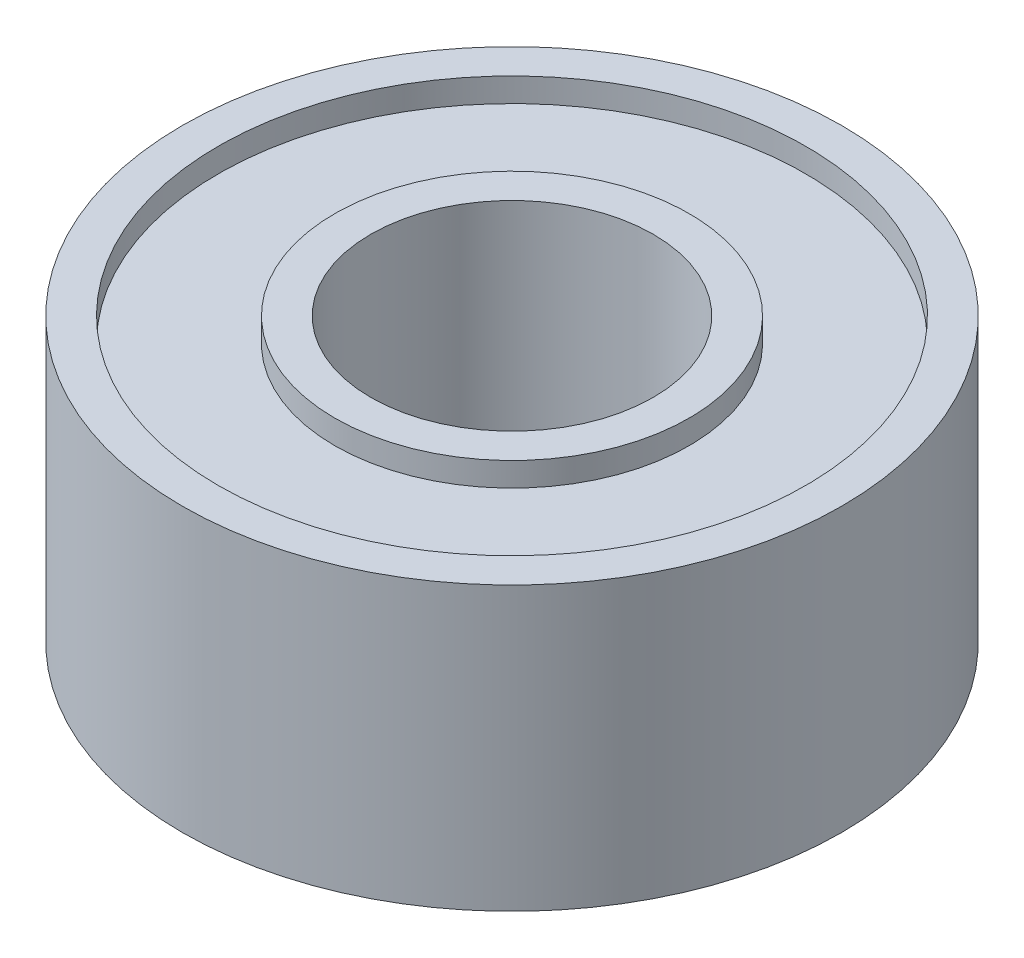
ISO-10303-21;
HEADER;
FILE_DESCRIPTION(('STEP AP214'),'2;1');
FILE_NAME('part.step','',(''),(''),'','','');
FILE_SCHEMA(('AUTOMOTIVE_DESIGN { 1 0 10303 214 1 1 1 1 }'));
ENDSEC;
DATA;
#1=APPLICATION_CONTEXT('core data for automotive mechanical design processes');
#2=APPLICATION_PROTOCOL_DEFINITION('international standard','automotive_design',2000,#1);
#3=PRODUCT_CONTEXT('',#1,'mechanical');
#4=PRODUCT('Part','Part','',(#3));
#5=PRODUCT_RELATED_PRODUCT_CATEGORY('part','',(#4));
#6=PRODUCT_DEFINITION_FORMATION('','',#4);
#7=PRODUCT_DEFINITION_CONTEXT('part definition',#1,'design');
#8=PRODUCT_DEFINITION('design','',#6,#7);
#9=PRODUCT_DEFINITION_SHAPE('','',#8);
#10=(LENGTH_UNIT() NAMED_UNIT(*) SI_UNIT(.MILLI.,.METRE.));
#11=(NAMED_UNIT(*) PLANE_ANGLE_UNIT() SI_UNIT($,.RADIAN.));
#12=(NAMED_UNIT(*) SI_UNIT($,.STERADIAN.) SOLID_ANGLE_UNIT());
#13=UNCERTAINTY_MEASURE_WITH_UNIT(LENGTH_MEASURE(1.E-05),#10,'distance_accuracy_value','');
#14=(GEOMETRIC_REPRESENTATION_CONTEXT(3) GLOBAL_UNCERTAINTY_ASSIGNED_CONTEXT((#13)) GLOBAL_UNIT_ASSIGNED_CONTEXT((#10,
#11,#12)) REPRESENTATION_CONTEXT('',''));
#15=CARTESIAN_POINT('',(0.,0.,0.));
#16=DIRECTION('',(0.,0.,1.));
#17=DIRECTION('',(1.,0.,0.));
#18=AXIS2_PLACEMENT_3D('',#15,#16,#17);
#19=CARTESIAN_POINT('',(0.,-1.5,0.));
#20=DIRECTION('',(0.,1.,0.));
#21=DIRECTION('',(0.,0.,1.));
#22=AXIS2_PLACEMENT_3D('',#19,#20,#21);
#23=PLANE('',#22);
#24=CARTESIAN_POINT('',(0.,-1.5,0.));
#25=DIRECTION('',(0.,1.,0.));
#26=DIRECTION('',(0.,0.,1.));
#27=AXIS2_PLACEMENT_3D('',#24,#25,#26);
#28=CIRCLE('',#27,1.5);
#29=CARTESIAN_POINT('',(0.,-1.5,1.5));
#30=VERTEX_POINT('',#29);
#31=EDGE_CURVE('E58',#30,#30,#28,.T.);
#32=ORIENTED_EDGE('',*,*,#31,.T.);
#33=EDGE_LOOP('',(#32));
#34=FACE_BOUND('',#33,.T.);
#35=CARTESIAN_POINT('',(0.,-1.5,0.));
#36=DIRECTION('',(0.,1.,0.));
#37=DIRECTION('',(0.,0.,1.));
#38=AXIS2_PLACEMENT_3D('',#35,#36,#37);
#39=CIRCLE('',#38,1.881);
#40=CARTESIAN_POINT('',(0.,-1.5,1.881));
#41=VERTEX_POINT('',#40);
#42=EDGE_CURVE('E90',#41,#41,#39,.T.);
#43=ORIENTED_EDGE('',*,*,#42,.F.);
#44=EDGE_LOOP('',(#43));
#45=FACE_BOUND('',#44,.T.);
#46=ADVANCED_FACE('F43',(#34,#45),#23,.F.);
#47=CARTESIAN_POINT('',(0.,1.5,0.));
#48=DIRECTION('',(0.,1.,0.));
#49=DIRECTION('',(0.,0.,1.));
#50=AXIS2_PLACEMENT_3D('',#47,#48,#49);
#51=PLANE('',#50);
#52=CARTESIAN_POINT('',(0.,1.5,0.));
#53=DIRECTION('',(0.,1.,0.));
#54=DIRECTION('',(0.,0.,1.));
#55=AXIS2_PLACEMENT_3D('',#52,#53,#54);
#56=CIRCLE('',#55,1.5);
#57=CARTESIAN_POINT('',(0.,1.5,1.5));
#58=VERTEX_POINT('',#57);
#59=EDGE_CURVE('E56',#58,#58,#56,.T.);
#60=ORIENTED_EDGE('',*,*,#59,.F.);
#61=EDGE_LOOP('',(#60));
#62=FACE_BOUND('',#61,.T.);
#63=CARTESIAN_POINT('',(0.,1.5,0.));
#64=DIRECTION('',(0.,1.,0.));
#65=DIRECTION('',(0.,0.,1.));
#66=AXIS2_PLACEMENT_3D('',#63,#64,#65);
#67=CIRCLE('',#66,1.881);
#68=CARTESIAN_POINT('',(0.,1.5,1.881));
#69=VERTEX_POINT('',#68);
#70=EDGE_CURVE('E74',#69,#69,#67,.T.);
#71=ORIENTED_EDGE('',*,*,#70,.T.);
#72=EDGE_LOOP('',(#71));
#73=FACE_BOUND('',#72,.T.);
#74=ADVANCED_FACE('F108',(#62,#73),#51,.T.);
#75=CARTESIAN_POINT('',(0.,1.5,0.));
#76=DIRECTION('',(0.,1.,0.));
#77=DIRECTION('',(0.,0.,1.));
#78=AXIS2_PLACEMENT_3D('',#75,#76,#77);
#79=CIRCLE('',#78,3.119);
#80=CARTESIAN_POINT('',(0.,1.5,3.119));
#81=VERTEX_POINT('',#80);
#82=EDGE_CURVE('E66',#81,#81,#79,.T.);
#83=ORIENTED_EDGE('',*,*,#82,.F.);
#84=EDGE_LOOP('',(#83));
#85=FACE_BOUND('',#84,.T.);
#86=CARTESIAN_POINT('',(0.,1.5,0.));
#87=DIRECTION('',(0.,1.,0.));
#88=DIRECTION('',(0.,0.,1.));
#89=AXIS2_PLACEMENT_3D('',#86,#87,#88);
#90=CIRCLE('',#89,3.5);
#91=CARTESIAN_POINT('',(0.,1.5,3.5));
#92=VERTEX_POINT('',#91);
#93=EDGE_CURVE('E10',#92,#92,#90,.T.);
#94=ORIENTED_EDGE('',*,*,#93,.T.);
#95=EDGE_LOOP('',(#94));
#96=FACE_BOUND('',#95,.T.);
#97=ADVANCED_FACE('F116',(#85,#96),#51,.T.);
#98=CARTESIAN_POINT('',(0.,-1.5,0.));
#99=DIRECTION('',(0.,1.,0.));
#100=DIRECTION('',(0.,0.,1.));
#101=AXIS2_PLACEMENT_3D('',#98,#99,#100);
#102=CIRCLE('',#101,3.119);
#103=CARTESIAN_POINT('',(0.,-1.5,3.119));
#104=VERTEX_POINT('',#103);
#105=EDGE_CURVE('E82',#104,#104,#102,.T.);
#106=ORIENTED_EDGE('',*,*,#105,.T.);
#107=EDGE_LOOP('',(#106));
#108=FACE_BOUND('',#107,.T.);
#109=CARTESIAN_POINT('',(0.,-1.5,0.));
#110=DIRECTION('',(0.,1.,0.));
#111=DIRECTION('',(0.,0.,1.));
#112=AXIS2_PLACEMENT_3D('',#109,#110,#111);
#113=CIRCLE('',#112,3.5);
#114=CARTESIAN_POINT('',(0.,-1.5,3.5));
#115=VERTEX_POINT('',#114);
#116=EDGE_CURVE('E47',#115,#115,#113,.T.);
#117=ORIENTED_EDGE('',*,*,#116,.F.);
#118=EDGE_LOOP('',(#117));
#119=FACE_BOUND('',#118,.T.);
#120=ADVANCED_FACE('F110',(#108,#119),#23,.F.);
#121=CARTESIAN_POINT('',(0.,1.5,0.));
#122=DIRECTION('',(0.,-1.,0.));
#123=DIRECTION('',(0.,0.,-1.));
#124=AXIS2_PLACEMENT_3D('',#121,#122,#123);
#125=CYLINDRICAL_SURFACE('',#124,3.5);
#126=ORIENTED_EDGE('',*,*,#93,.F.);
#127=EDGE_LOOP('',(#126));
#128=FACE_BOUND('',#127,.T.);
#129=ORIENTED_EDGE('',*,*,#116,.T.);
#130=EDGE_LOOP('',(#129));
#131=FACE_BOUND('',#130,.T.);
#132=ADVANCED_FACE('F45',(#128,#131),#125,.T.);
#133=CARTESIAN_POINT('',(0.,1.5,0.));
#134=DIRECTION('',(0.,-1.,0.));
#135=DIRECTION('',(0.,0.,-1.));
#136=AXIS2_PLACEMENT_3D('',#133,#134,#135);
#137=CYLINDRICAL_SURFACE('',#136,1.5);
#138=ORIENTED_EDGE('',*,*,#59,.T.);
#139=EDGE_LOOP('',(#138));
#140=FACE_BOUND('',#139,.T.);
#141=ORIENTED_EDGE('',*,*,#31,.F.);
#142=EDGE_LOOP('',(#141));
#143=FACE_BOUND('',#142,.T.);
#144=ADVANCED_FACE('F124',(#140,#143),#137,.F.);
#145=CARTESIAN_POINT('',(0.,1.246,0.));
#146=DIRECTION('',(0.,1.,0.));
#147=DIRECTION('',(0.,0.,1.));
#148=AXIS2_PLACEMENT_3D('',#145,#146,#147);
#149=CYLINDRICAL_SURFACE('',#148,3.119);
#150=CARTESIAN_POINT('',(0.,1.246,0.));
#151=DIRECTION('',(0.,1.,0.));
#152=DIRECTION('',(0.,0.,1.));
#153=AXIS2_PLACEMENT_3D('',#150,#151,#152);
#154=CIRCLE('',#153,3.119);
#155=CARTESIAN_POINT('',(0.,1.246,3.119));
#156=VERTEX_POINT('',#155);
#157=EDGE_CURVE('E62',#156,#156,#154,.T.);
#158=ORIENTED_EDGE('',*,*,#157,.F.);
#159=EDGE_LOOP('',(#158));
#160=FACE_BOUND('',#159,.T.);
#161=ORIENTED_EDGE('',*,*,#82,.T.);
#162=EDGE_LOOP('',(#161));
#163=FACE_BOUND('',#162,.T.);
#164=ADVANCED_FACE('F147',(#160,#163),#149,.F.);
#165=CARTESIAN_POINT('',(0.,1.246,0.));
#166=DIRECTION('',(0.,1.,0.));
#167=DIRECTION('',(0.,0.,1.));
#168=AXIS2_PLACEMENT_3D('',#165,#166,#167);
#169=PLANE('',#168);
#170=CARTESIAN_POINT('',(0.,1.246,0.));
#171=DIRECTION('',(0.,1.,0.));
#172=DIRECTION('',(0.,0.,1.));
#173=AXIS2_PLACEMENT_3D('',#170,#171,#172);
#174=CIRCLE('',#173,1.881);
#175=CARTESIAN_POINT('',(0.,1.246,1.881));
#176=VERTEX_POINT('',#175);
#177=EDGE_CURVE('E70',#176,#176,#174,.T.);
#178=ORIENTED_EDGE('',*,*,#177,.F.);
#179=EDGE_LOOP('',(#178));
#180=FACE_BOUND('',#179,.T.);
#181=ORIENTED_EDGE('',*,*,#157,.T.);
#182=EDGE_LOOP('',(#181));
#183=FACE_BOUND('',#182,.T.);
#184=ADVANCED_FACE('F143',(#180,#183),#169,.T.);
#185=CARTESIAN_POINT('',(0.,1.246,0.));
#186=DIRECTION('',(0.,1.,0.));
#187=DIRECTION('',(0.,0.,1.));
#188=AXIS2_PLACEMENT_3D('',#185,#186,#187);
#189=CYLINDRICAL_SURFACE('',#188,1.881);
#190=ORIENTED_EDGE('',*,*,#177,.T.);
#191=EDGE_LOOP('',(#190));
#192=FACE_BOUND('',#191,.T.);
#193=ORIENTED_EDGE('',*,*,#70,.F.);
#194=EDGE_LOOP('',(#193));
#195=FACE_BOUND('',#194,.T.);
#196=ADVANCED_FACE('F138',(#192,#195),#189,.T.);
#197=CARTESIAN_POINT('',(0.,-1.246,0.));
#198=DIRECTION('',(0.,-1.,0.));
#199=DIRECTION('',(0.,0.,1.));
#200=AXIS2_PLACEMENT_3D('',#197,#198,#199);
#201=PLANE('',#200);
#202=CARTESIAN_POINT('',(0.,-1.246,0.));
#203=DIRECTION('',(0.,1.,0.));
#204=DIRECTION('',(0.,0.,1.));
#205=AXIS2_PLACEMENT_3D('',#202,#203,#204);
#206=CIRCLE('',#205,3.119);
#207=CARTESIAN_POINT('',(0.,-1.246,3.119));
#208=VERTEX_POINT('',#207);
#209=EDGE_CURVE('E78',#208,#208,#206,.T.);
#210=ORIENTED_EDGE('',*,*,#209,.F.);
#211=EDGE_LOOP('',(#210));
#212=FACE_BOUND('',#211,.T.);
#213=CARTESIAN_POINT('',(0.,-1.246,0.));
#214=DIRECTION('',(0.,1.,0.));
#215=DIRECTION('',(0.,0.,1.));
#216=AXIS2_PLACEMENT_3D('',#213,#214,#215);
#217=CIRCLE('',#216,1.881);
#218=CARTESIAN_POINT('',(0.,-1.246,1.881));
#219=VERTEX_POINT('',#218);
#220=EDGE_CURVE('E86',#219,#219,#217,.T.);
#221=ORIENTED_EDGE('',*,*,#220,.T.);
#222=EDGE_LOOP('',(#221));
#223=FACE_BOUND('',#222,.T.);
#224=ADVANCED_FACE('F98',(#212,#223),#201,.T.);
#225=CARTESIAN_POINT('',(0.,-1.246,0.));
#226=DIRECTION('',(0.,-1.,0.));
#227=DIRECTION('',(0.,0.,-1.));
#228=AXIS2_PLACEMENT_3D('',#225,#226,#227);
#229=CYLINDRICAL_SURFACE('',#228,3.119);
#230=ORIENTED_EDGE('',*,*,#209,.T.);
#231=EDGE_LOOP('',(#230));
#232=FACE_BOUND('',#231,.T.);
#233=ORIENTED_EDGE('',*,*,#105,.F.);
#234=EDGE_LOOP('',(#233));
#235=FACE_BOUND('',#234,.T.);
#236=ADVANCED_FACE('F103',(#232,#235),#229,.F.);
#237=CARTESIAN_POINT('',(0.,-1.246,0.));
#238=DIRECTION('',(0.,-1.,0.));
#239=DIRECTION('',(0.,0.,-1.));
#240=AXIS2_PLACEMENT_3D('',#237,#238,#239);
#241=CYLINDRICAL_SURFACE('',#240,1.881);
#242=ORIENTED_EDGE('',*,*,#220,.F.);
#243=EDGE_LOOP('',(#242));
#244=FACE_BOUND('',#243,.T.);
#245=ORIENTED_EDGE('',*,*,#42,.T.);
#246=EDGE_LOOP('',(#245));
#247=FACE_BOUND('',#246,.T.);
#248=ADVANCED_FACE('F100',(#244,#247),#241,.T.);
#249=CLOSED_SHELL('',(#46,#74,#97,#120,#132,#144,#164,#184,#196,#224,#236,#248));
#250=MANIFOLD_SOLID_BREP('B2',#249);
#251=ADVANCED_BREP_SHAPE_REPRESENTATION('',(#18,#250),#14);
#252=SHAPE_DEFINITION_REPRESENTATION(#9,#251);
ENDSEC;
END-ISO-10303-21;
